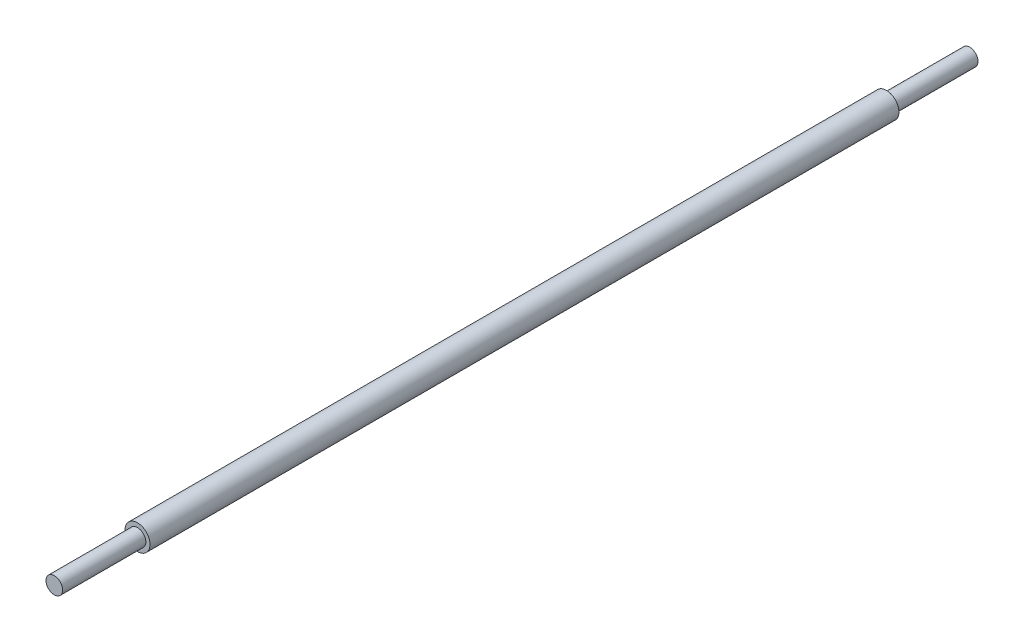
ISO-10303-21;
HEADER;
FILE_DESCRIPTION(('STEP AP214'),'2;1');
FILE_NAME('part.step','',(''),(''),'','','');
FILE_SCHEMA(('AUTOMOTIVE_DESIGN { 1 0 10303 214 1 1 1 1 }'));
ENDSEC;
DATA;
#1=APPLICATION_CONTEXT('core data for automotive mechanical design processes');
#2=APPLICATION_PROTOCOL_DEFINITION('international standard','automotive_design',2000,#1);
#3=PRODUCT_CONTEXT('',#1,'mechanical');
#4=PRODUCT('Part','Part','',(#3));
#5=PRODUCT_RELATED_PRODUCT_CATEGORY('part','',(#4));
#6=PRODUCT_DEFINITION_FORMATION('','',#4);
#7=PRODUCT_DEFINITION_CONTEXT('part definition',#1,'design');
#8=PRODUCT_DEFINITION('design','',#6,#7);
#9=PRODUCT_DEFINITION_SHAPE('','',#8);
#10=(LENGTH_UNIT() NAMED_UNIT(*) SI_UNIT(.MILLI.,.METRE.));
#11=(NAMED_UNIT(*) PLANE_ANGLE_UNIT() SI_UNIT($,.RADIAN.));
#12=(NAMED_UNIT(*) SI_UNIT($,.STERADIAN.) SOLID_ANGLE_UNIT());
#13=UNCERTAINTY_MEASURE_WITH_UNIT(LENGTH_MEASURE(1.E-05),#10,'distance_accuracy_value','');
#14=(GEOMETRIC_REPRESENTATION_CONTEXT(3) GLOBAL_UNCERTAINTY_ASSIGNED_CONTEXT((#13)) GLOBAL_UNIT_ASSIGNED_CONTEXT((#10,
#11,#12)) REPRESENTATION_CONTEXT('',''));
#15=CARTESIAN_POINT('',(0.,0.,0.));
#16=DIRECTION('',(0.,0.,1.));
#17=DIRECTION('',(1.,0.,0.));
#18=AXIS2_PLACEMENT_3D('',#15,#16,#17);
#19=CARTESIAN_POINT('',(0.,0.,400.));
#20=DIRECTION('',(0.,0.,-1.));
#21=DIRECTION('',(-1.,0.,0.));
#22=AXIS2_PLACEMENT_3D('',#19,#20,#21);
#23=CYLINDRICAL_SURFACE('',#22,6.);
#24=CARTESIAN_POINT('',(0.,0.,0.));
#25=DIRECTION('',(0.,0.,1.));
#26=DIRECTION('',(1.,0.,0.));
#27=AXIS2_PLACEMENT_3D('',#24,#25,#26);
#28=CIRCLE('',#27,6.);
#29=CARTESIAN_POINT('',(6.,0.,0.));
#30=VERTEX_POINT('',#29);
#31=EDGE_CURVE('E63',#30,#30,#28,.T.);
#32=ORIENTED_EDGE('',*,*,#31,.T.);
#33=EDGE_LOOP('',(#32));
#34=FACE_BOUND('',#33,.T.);
#35=CARTESIAN_POINT('',(0.,0.,360.));
#36=DIRECTION('',(0.,0.,1.));
#37=DIRECTION('',(1.,0.,0.));
#38=AXIS2_PLACEMENT_3D('',#35,#36,#37);
#39=CIRCLE('',#38,6.);
#40=CARTESIAN_POINT('',(6.,0.,360.));
#41=VERTEX_POINT('',#40);
#42=EDGE_CURVE('E59',#41,#41,#39,.T.);
#43=ORIENTED_EDGE('',*,*,#42,.F.);
#44=EDGE_LOOP('',(#43));
#45=FACE_BOUND('',#44,.T.);
#46=ADVANCED_FACE('F56',(#34,#45),#23,.T.);
#47=CARTESIAN_POINT('',(0.,0.,0.));
#48=DIRECTION('',(0.,0.,1.));
#49=DIRECTION('',(1.,0.,0.));
#50=AXIS2_PLACEMENT_3D('',#47,#48,#49);
#51=PLANE('',#50);
#52=CARTESIAN_POINT('',(0.,0.,0.));
#53=DIRECTION('',(0.,0.,-1.));
#54=DIRECTION('',(-1.,0.,0.));
#55=AXIS2_PLACEMENT_3D('',#52,#53,#54);
#56=CIRCLE('',#55,4.);
#57=CARTESIAN_POINT('',(-4.,0.,0.));
#58=VERTEX_POINT('',#57);
#59=EDGE_CURVE('E12',#58,#58,#56,.T.);
#60=ORIENTED_EDGE('',*,*,#59,.F.);
#61=EDGE_LOOP('',(#60));
#62=FACE_BOUND('',#61,.T.);
#63=ORIENTED_EDGE('',*,*,#31,.F.);
#64=EDGE_LOOP('',(#63));
#65=FACE_BOUND('',#64,.T.);
#66=ADVANCED_FACE('F96',(#62,#65),#51,.F.);
#67=CARTESIAN_POINT('',(0.,0.,360.));
#68=DIRECTION('',(0.,0.,1.));
#69=DIRECTION('',(1.,0.,0.));
#70=AXIS2_PLACEMENT_3D('',#67,#68,#69);
#71=PLANE('',#70);
#72=CARTESIAN_POINT('',(0.,0.,360.));
#73=DIRECTION('',(0.,0.,1.));
#74=DIRECTION('',(1.,0.,0.));
#75=AXIS2_PLACEMENT_3D('',#72,#73,#74);
#76=CIRCLE('',#75,4.);
#77=CARTESIAN_POINT('',(4.,0.,360.));
#78=VERTEX_POINT('',#77);
#79=EDGE_CURVE('E71',#78,#78,#76,.T.);
#80=ORIENTED_EDGE('',*,*,#79,.F.);
#81=EDGE_LOOP('',(#80));
#82=FACE_BOUND('',#81,.T.);
#83=ORIENTED_EDGE('',*,*,#42,.T.);
#84=EDGE_LOOP('',(#83));
#85=FACE_BOUND('',#84,.T.);
#86=ADVANCED_FACE('F101',(#82,#85),#71,.T.);
#87=CARTESIAN_POINT('',(0.,0.,360.));
#88=DIRECTION('',(0.,0.,1.));
#89=DIRECTION('',(1.,0.,0.));
#90=AXIS2_PLACEMENT_3D('',#87,#88,#89);
#91=CYLINDRICAL_SURFACE('',#90,4.);
#92=ORIENTED_EDGE('',*,*,#79,.T.);
#93=EDGE_LOOP('',(#92));
#94=FACE_BOUND('',#93,.T.);
#95=CARTESIAN_POINT('',(0.,0.,400.));
#96=DIRECTION('',(0.,0.,1.));
#97=DIRECTION('',(1.,0.,0.));
#98=AXIS2_PLACEMENT_3D('',#95,#96,#97);
#99=CIRCLE('',#98,4.);
#100=CARTESIAN_POINT('',(4.,0.,400.));
#101=VERTEX_POINT('',#100);
#102=EDGE_CURVE('E74',#101,#101,#99,.T.);
#103=ORIENTED_EDGE('',*,*,#102,.F.);
#104=EDGE_LOOP('',(#103));
#105=FACE_BOUND('',#104,.T.);
#106=ADVANCED_FACE('F92',(#94,#105),#91,.T.);
#107=CARTESIAN_POINT('',(0.,0.,400.));
#108=DIRECTION('',(0.,0.,1.));
#109=DIRECTION('',(1.,0.,0.));
#110=AXIS2_PLACEMENT_3D('',#107,#108,#109);
#111=PLANE('',#110);
#112=ORIENTED_EDGE('',*,*,#102,.T.);
#113=EDGE_LOOP('',(#112));
#114=FACE_BOUND('',#113,.T.);
#115=ADVANCED_FACE('F85',(#114),#111,.T.);
#116=CARTESIAN_POINT('',(0.,0.,-40.));
#117=DIRECTION('',(0.,0.,1.));
#118=DIRECTION('',(1.,0.,0.));
#119=AXIS2_PLACEMENT_3D('',#116,#117,#118);
#120=CYLINDRICAL_SURFACE('',#119,4.);
#121=CARTESIAN_POINT('',(0.,0.,-40.));
#122=DIRECTION('',(0.,0.,-1.));
#123=DIRECTION('',(-1.,0.,0.));
#124=AXIS2_PLACEMENT_3D('',#121,#122,#123);
#125=CIRCLE('',#124,4.);
#126=CARTESIAN_POINT('',(-4.,0.,-40.));
#127=VERTEX_POINT('',#126);
#128=EDGE_CURVE('E70',#127,#127,#125,.T.);
#129=ORIENTED_EDGE('',*,*,#128,.F.);
#130=EDGE_LOOP('',(#129));
#131=FACE_BOUND('',#130,.T.);
#132=ORIENTED_EDGE('',*,*,#59,.T.);
#133=EDGE_LOOP('',(#132));
#134=FACE_BOUND('',#133,.T.);
#135=ADVANCED_FACE('F83',(#131,#134),#120,.T.);
#136=CARTESIAN_POINT('',(0.,0.,-40.));
#137=DIRECTION('',(0.,0.,-1.));
#138=DIRECTION('',(-1.,0.,0.));
#139=AXIS2_PLACEMENT_3D('',#136,#137,#138);
#140=PLANE('',#139);
#141=ORIENTED_EDGE('',*,*,#128,.T.);
#142=EDGE_LOOP('',(#141));
#143=FACE_BOUND('',#142,.T.);
#144=ADVANCED_FACE('F81',(#143),#140,.T.);
#145=CLOSED_SHELL('',(#46,#66,#86,#106,#115,#135,#144));
#146=MANIFOLD_SOLID_BREP('B2',#145);
#147=ADVANCED_BREP_SHAPE_REPRESENTATION('',(#18,#146),#14);
#148=SHAPE_DEFINITION_REPRESENTATION(#9,#147);
ENDSEC;
END-ISO-10303-21;
